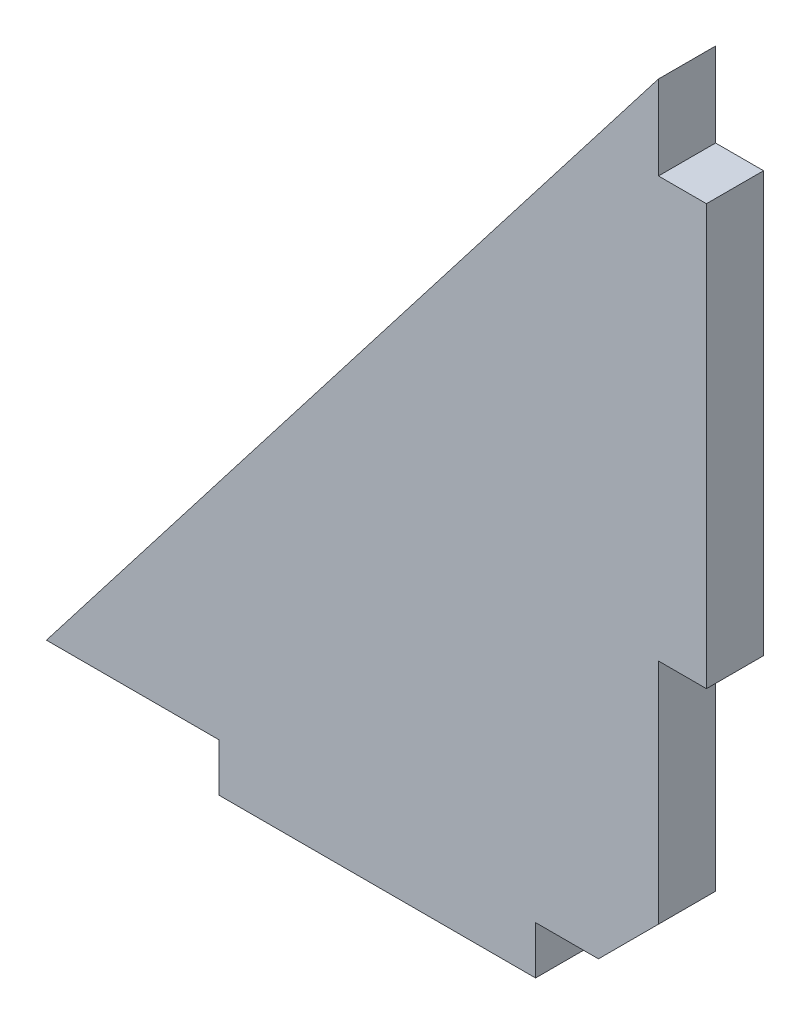
ISO-10303-21;
HEADER;
FILE_DESCRIPTION(('STEP AP214'),'2;1');
FILE_NAME('part.step','',(''),(''),'','','');
FILE_SCHEMA(('AUTOMOTIVE_DESIGN { 1 0 10303 214 1 1 1 1 }'));
ENDSEC;
DATA;
#1=APPLICATION_CONTEXT('core data for automotive mechanical design processes');
#2=APPLICATION_PROTOCOL_DEFINITION('international standard','automotive_design',2000,#1);
#3=PRODUCT_CONTEXT('',#1,'mechanical');
#4=PRODUCT('Part','Part','',(#3));
#5=PRODUCT_RELATED_PRODUCT_CATEGORY('part','',(#4));
#6=PRODUCT_DEFINITION_FORMATION('','',#4);
#7=PRODUCT_DEFINITION_CONTEXT('part definition',#1,'design');
#8=PRODUCT_DEFINITION('design','',#6,#7);
#9=PRODUCT_DEFINITION_SHAPE('','',#8);
#10=(LENGTH_UNIT() NAMED_UNIT(*) SI_UNIT(.MILLI.,.METRE.));
#11=(NAMED_UNIT(*) PLANE_ANGLE_UNIT() SI_UNIT($,.RADIAN.));
#12=(NAMED_UNIT(*) SI_UNIT($,.STERADIAN.) SOLID_ANGLE_UNIT());
#13=UNCERTAINTY_MEASURE_WITH_UNIT(LENGTH_MEASURE(1.E-05),#10,'distance_accuracy_value','');
#14=(GEOMETRIC_REPRESENTATION_CONTEXT(3) GLOBAL_UNCERTAINTY_ASSIGNED_CONTEXT((#13)) GLOBAL_UNIT_ASSIGNED_CONTEXT((#10,
#11,#12)) REPRESENTATION_CONTEXT('',''));
#15=CARTESIAN_POINT('',(0.,0.,0.));
#16=DIRECTION('',(0.,0.,1.));
#17=DIRECTION('',(1.,0.,0.));
#18=AXIS2_PLACEMENT_3D('',#15,#16,#17);
#19=CARTESIAN_POINT('',(-51.,-66.,4.76));
#20=DIRECTION('',(0.791285001392167,-0.611447501075765,0.));
#21=DIRECTION('',(0.611447501075765,0.791285001392167,0.));
#22=AXIS2_PLACEMENT_3D('',#19,#20,#21);
#23=PLANE('',#22);
#24=DIRECTION('',(-0.611447501075765,-0.791285001392167,0.));
#25=VECTOR('',#24,1.);
#26=CARTESIAN_POINT('',(-51.,-66.,0.));
#27=LINE('',#26,#25);
#28=CARTESIAN_POINT('',(0.,0.,0.));
#29=VERTEX_POINT('',#28);
#30=CARTESIAN_POINT('',(-51.,-66.,0.));
#31=VERTEX_POINT('',#30);
#32=EDGE_CURVE('E271',#29,#31,#27,.T.);
#33=ORIENTED_EDGE('',*,*,#32,.T.);
#34=DIRECTION('',(0.,0.,-1.));
#35=VECTOR('',#34,1.);
#36=CARTESIAN_POINT('',(-51.,-66.,4.76));
#37=LINE('',#36,#35);
#38=CARTESIAN_POINT('',(-51.,-66.,4.76));
#39=VERTEX_POINT('',#38);
#40=EDGE_CURVE('E12',#39,#31,#37,.T.);
#41=ORIENTED_EDGE('',*,*,#40,.F.);
#42=DIRECTION('',(-0.611447501075765,-0.791285001392167,0.));
#43=VECTOR('',#42,1.);
#44=CARTESIAN_POINT('',(-51.,-66.,4.76));
#45=LINE('',#44,#43);
#46=CARTESIAN_POINT('',(0.,0.,4.76));
#47=VERTEX_POINT('',#46);
#48=EDGE_CURVE('E209',#47,#39,#45,.T.);
#49=ORIENTED_EDGE('',*,*,#48,.F.);
#50=DIRECTION('',(0.,0.,-1.));
#51=VECTOR('',#50,1.);
#52=CARTESIAN_POINT('',(0.,0.,4.76));
#53=LINE('',#52,#51);
#54=EDGE_CURVE('E165',#47,#29,#53,.T.);
#55=ORIENTED_EDGE('',*,*,#54,.T.);
#56=EDGE_LOOP('',(#33,#41,#49,#55));
#57=FACE_BOUND('',#56,.T.);
#58=ADVANCED_FACE('F44',(#57),#23,.F.);
#59=CARTESIAN_POINT('',(-36.64,-66.,4.76));
#60=DIRECTION('',(0.,1.,0.));
#61=DIRECTION('',(0.,0.,1.));
#62=AXIS2_PLACEMENT_3D('',#59,#60,#61);
#63=PLANE('',#62);
#64=DIRECTION('',(1.,0.,0.));
#65=VECTOR('',#64,1.);
#66=CARTESIAN_POINT('',(-36.64,-66.,0.));
#67=LINE('',#66,#65);
#68=CARTESIAN_POINT('',(-36.64,-66.,0.));
#69=VERTEX_POINT('',#68);
#70=EDGE_CURVE('E262',#31,#69,#67,.T.);
#71=ORIENTED_EDGE('',*,*,#70,.T.);
#72=DIRECTION('',(0.,0.,-1.));
#73=VECTOR('',#72,1.);
#74=CARTESIAN_POINT('',(-36.64,-66.,4.76));
#75=LINE('',#74,#73);
#76=CARTESIAN_POINT('',(-36.64,-66.,4.76));
#77=VERTEX_POINT('',#76);
#78=EDGE_CURVE('E53',#77,#69,#75,.T.);
#79=ORIENTED_EDGE('',*,*,#78,.F.);
#80=DIRECTION('',(1.,0.,0.));
#81=VECTOR('',#80,1.);
#82=CARTESIAN_POINT('',(-36.64,-66.,4.76));
#83=LINE('',#82,#81);
#84=EDGE_CURVE('E116',#39,#77,#83,.T.);
#85=ORIENTED_EDGE('',*,*,#84,.F.);
#86=ORIENTED_EDGE('',*,*,#40,.T.);
#87=EDGE_LOOP('',(#71,#79,#85,#86));
#88=FACE_BOUND('',#87,.T.);
#89=ADVANCED_FACE('F307',(#88),#63,.F.);
#90=CARTESIAN_POINT('',(-36.64,-70.,4.76));
#91=DIRECTION('',(1.,0.,0.));
#92=DIRECTION('',(0.,1.,0.));
#93=AXIS2_PLACEMENT_3D('',#90,#91,#92);
#94=PLANE('',#93);
#95=DIRECTION('',(0.,-1.,0.));
#96=VECTOR('',#95,1.);
#97=CARTESIAN_POINT('',(-36.64,-70.,0.));
#98=LINE('',#97,#96);
#99=CARTESIAN_POINT('',(-36.64,-70.,0.));
#100=VERTEX_POINT('',#99);
#101=EDGE_CURVE('E257',#69,#100,#98,.T.);
#102=ORIENTED_EDGE('',*,*,#101,.T.);
#103=DIRECTION('',(0.,0.,-1.));
#104=VECTOR('',#103,1.);
#105=CARTESIAN_POINT('',(-36.64,-70.,4.76));
#106=LINE('',#105,#104);
#107=CARTESIAN_POINT('',(-36.64,-70.,4.76));
#108=VERTEX_POINT('',#107);
#109=EDGE_CURVE('E247',#108,#100,#106,.T.);
#110=ORIENTED_EDGE('',*,*,#109,.F.);
#111=DIRECTION('',(0.,-1.,0.));
#112=VECTOR('',#111,1.);
#113=CARTESIAN_POINT('',(-36.64,-70.,4.76));
#114=LINE('',#113,#112);
#115=EDGE_CURVE('E201',#77,#108,#114,.T.);
#116=ORIENTED_EDGE('',*,*,#115,.F.);
#117=ORIENTED_EDGE('',*,*,#78,.T.);
#118=EDGE_LOOP('',(#102,#110,#116,#117));
#119=FACE_BOUND('',#118,.T.);
#120=ADVANCED_FACE('F255',(#119),#94,.F.);
#121=CARTESIAN_POINT('',(-10.24,-70.,4.76));
#122=DIRECTION('',(0.,1.,0.));
#123=DIRECTION('',(0.,0.,1.));
#124=AXIS2_PLACEMENT_3D('',#121,#122,#123);
#125=PLANE('',#124);
#126=DIRECTION('',(1.,0.,0.));
#127=VECTOR('',#126,1.);
#128=CARTESIAN_POINT('',(-10.24,-70.,0.));
#129=LINE('',#128,#127);
#130=CARTESIAN_POINT('',(-10.24,-70.,0.));
#131=VERTEX_POINT('',#130);
#132=EDGE_CURVE('E264',#100,#131,#129,.T.);
#133=ORIENTED_EDGE('',*,*,#132,.T.);
#134=DIRECTION('',(0.,0.,-1.));
#135=VECTOR('',#134,1.);
#136=CARTESIAN_POINT('',(-10.24,-70.,4.76));
#137=LINE('',#136,#135);
#138=CARTESIAN_POINT('',(-10.24,-70.,4.76));
#139=VERTEX_POINT('',#138);
#140=EDGE_CURVE('E243',#139,#131,#137,.T.);
#141=ORIENTED_EDGE('',*,*,#140,.F.);
#142=DIRECTION('',(1.,0.,0.));
#143=VECTOR('',#142,1.);
#144=CARTESIAN_POINT('',(-10.24,-70.,4.76));
#145=LINE('',#144,#143);
#146=EDGE_CURVE('E197',#108,#139,#145,.T.);
#147=ORIENTED_EDGE('',*,*,#146,.F.);
#148=ORIENTED_EDGE('',*,*,#109,.T.);
#149=EDGE_LOOP('',(#133,#141,#147,#148));
#150=FACE_BOUND('',#149,.T.);
#151=ADVANCED_FACE('F314',(#150),#125,.F.);
#152=CARTESIAN_POINT('',(-10.24,-66.,4.76));
#153=DIRECTION('',(-1.,0.,0.));
#154=DIRECTION('',(0.,-1.,0.));
#155=AXIS2_PLACEMENT_3D('',#152,#153,#154);
#156=PLANE('',#155);
#157=DIRECTION('',(0.,1.,0.));
#158=VECTOR('',#157,1.);
#159=CARTESIAN_POINT('',(-10.24,-66.,0.));
#160=LINE('',#159,#158);
#161=CARTESIAN_POINT('',(-10.24,-66.,0.));
#162=VERTEX_POINT('',#161);
#163=EDGE_CURVE('E269',#131,#162,#160,.T.);
#164=ORIENTED_EDGE('',*,*,#163,.T.);
#165=DIRECTION('',(0.,0.,-1.));
#166=VECTOR('',#165,1.);
#167=CARTESIAN_POINT('',(-10.24,-66.,4.76));
#168=LINE('',#167,#166);
#169=CARTESIAN_POINT('',(-10.24,-66.,4.76));
#170=VERTEX_POINT('',#169);
#171=EDGE_CURVE('E239',#170,#162,#168,.T.);
#172=ORIENTED_EDGE('',*,*,#171,.F.);
#173=DIRECTION('',(0.,1.,0.));
#174=VECTOR('',#173,1.);
#175=CARTESIAN_POINT('',(-10.24,-66.,4.76));
#176=LINE('',#175,#174);
#177=EDGE_CURVE('E194',#139,#170,#176,.T.);
#178=ORIENTED_EDGE('',*,*,#177,.F.);
#179=ORIENTED_EDGE('',*,*,#140,.T.);
#180=EDGE_LOOP('',(#164,#172,#178,#179));
#181=FACE_BOUND('',#180,.T.);
#182=ADVANCED_FACE('F319',(#181),#156,.F.);
#183=CARTESIAN_POINT('',(-5.00000000000002,-66.,4.76));
#184=DIRECTION('',(0.,1.,0.));
#185=DIRECTION('',(0.,0.,1.));
#186=AXIS2_PLACEMENT_3D('',#183,#184,#185);
#187=PLANE('',#186);
#188=DIRECTION('',(1.,0.,0.));
#189=VECTOR('',#188,1.);
#190=CARTESIAN_POINT('',(-5.00000000000002,-66.,0.));
#191=LINE('',#190,#189);
#192=CARTESIAN_POINT('',(-5.00000000000002,-66.,0.));
#193=VERTEX_POINT('',#192);
#194=EDGE_CURVE('E276',#162,#193,#191,.T.);
#195=ORIENTED_EDGE('',*,*,#194,.T.);
#196=DIRECTION('',(0.,0.,-1.));
#197=VECTOR('',#196,1.);
#198=CARTESIAN_POINT('',(-5.00000000000002,-66.,4.76));
#199=LINE('',#198,#197);
#200=CARTESIAN_POINT('',(-5.00000000000002,-66.,4.76));
#201=VERTEX_POINT('',#200);
#202=EDGE_CURVE('E235',#201,#193,#199,.T.);
#203=ORIENTED_EDGE('',*,*,#202,.F.);
#204=DIRECTION('',(1.,0.,0.));
#205=VECTOR('',#204,1.);
#206=CARTESIAN_POINT('',(-5.00000000000002,-66.,4.76));
#207=LINE('',#206,#205);
#208=EDGE_CURVE('E186',#170,#201,#207,.T.);
#209=ORIENTED_EDGE('',*,*,#208,.F.);
#210=ORIENTED_EDGE('',*,*,#171,.T.);
#211=EDGE_LOOP('',(#195,#203,#209,#210));
#212=FACE_BOUND('',#211,.T.);
#213=ADVANCED_FACE('F323',(#212),#187,.F.);
#214=CARTESIAN_POINT('',(0.,-61.,4.76));
#215=DIRECTION('',(-0.707106781186546,0.707106781186549,0.));
#216=DIRECTION('',(-0.707106781186549,-0.707106781186546,0.));
#217=AXIS2_PLACEMENT_3D('',#214,#215,#216);
#218=PLANE('',#217);
#219=DIRECTION('',(0.707106781186549,0.707106781186546,0.));
#220=VECTOR('',#219,1.);
#221=CARTESIAN_POINT('',(0.,-61.,0.));
#222=LINE('',#221,#220);
#223=CARTESIAN_POINT('',(0.,-61.,0.));
#224=VERTEX_POINT('',#223);
#225=EDGE_CURVE('E279',#193,#224,#222,.T.);
#226=ORIENTED_EDGE('',*,*,#225,.T.);
#227=DIRECTION('',(0.,0.,-1.));
#228=VECTOR('',#227,1.);
#229=CARTESIAN_POINT('',(0.,-61.,4.76));
#230=LINE('',#229,#228);
#231=CARTESIAN_POINT('',(0.,-61.,4.76));
#232=VERTEX_POINT('',#231);
#233=EDGE_CURVE('E231',#232,#224,#230,.T.);
#234=ORIENTED_EDGE('',*,*,#233,.F.);
#235=DIRECTION('',(0.707106781186549,0.707106781186546,0.));
#236=VECTOR('',#235,1.);
#237=CARTESIAN_POINT('',(0.,-61.,4.76));
#238=LINE('',#237,#236);
#239=EDGE_CURVE('E182',#201,#232,#238,.T.);
#240=ORIENTED_EDGE('',*,*,#239,.F.);
#241=ORIENTED_EDGE('',*,*,#202,.T.);
#242=EDGE_LOOP('',(#226,#234,#240,#241));
#243=FACE_BOUND('',#242,.T.);
#244=ADVANCED_FACE('F327',(#243),#218,.F.);
#245=CARTESIAN_POINT('',(0.,-42.,4.76));
#246=DIRECTION('',(-1.,0.,0.));
#247=DIRECTION('',(0.,-1.,0.));
#248=AXIS2_PLACEMENT_3D('',#245,#246,#247);
#249=PLANE('',#248);
#250=DIRECTION('',(0.,1.,0.));
#251=VECTOR('',#250,1.);
#252=CARTESIAN_POINT('',(0.,-42.,0.));
#253=LINE('',#252,#251);
#254=CARTESIAN_POINT('',(0.,-42.,0.));
#255=VERTEX_POINT('',#254);
#256=EDGE_CURVE('E282',#224,#255,#253,.T.);
#257=ORIENTED_EDGE('',*,*,#256,.T.);
#258=DIRECTION('',(0.,0.,-1.));
#259=VECTOR('',#258,1.);
#260=CARTESIAN_POINT('',(0.,-42.,4.76));
#261=LINE('',#260,#259);
#262=CARTESIAN_POINT('',(0.,-42.,4.76));
#263=VERTEX_POINT('',#262);
#264=EDGE_CURVE('E227',#263,#255,#261,.T.);
#265=ORIENTED_EDGE('',*,*,#264,.F.);
#266=DIRECTION('',(0.,1.,0.));
#267=VECTOR('',#266,1.);
#268=CARTESIAN_POINT('',(0.,-42.,4.76));
#269=LINE('',#268,#267);
#270=EDGE_CURVE('E178',#232,#263,#269,.T.);
#271=ORIENTED_EDGE('',*,*,#270,.F.);
#272=ORIENTED_EDGE('',*,*,#233,.T.);
#273=EDGE_LOOP('',(#257,#265,#271,#272));
#274=FACE_BOUND('',#273,.T.);
#275=ADVANCED_FACE('F331',(#274),#249,.F.);
#276=CARTESIAN_POINT('',(4.00000000000001,-42.,4.76));
#277=DIRECTION('',(0.,1.,0.));
#278=DIRECTION('',(0.,0.,1.));
#279=AXIS2_PLACEMENT_3D('',#276,#277,#278);
#280=PLANE('',#279);
#281=DIRECTION('',(1.,0.,0.));
#282=VECTOR('',#281,1.);
#283=CARTESIAN_POINT('',(4.00000000000001,-42.,0.));
#284=LINE('',#283,#282);
#285=CARTESIAN_POINT('',(4.00000000000001,-42.,0.));
#286=VERTEX_POINT('',#285);
#287=EDGE_CURVE('E285',#255,#286,#284,.T.);
#288=ORIENTED_EDGE('',*,*,#287,.T.);
#289=DIRECTION('',(0.,0.,-1.));
#290=VECTOR('',#289,1.);
#291=CARTESIAN_POINT('',(4.00000000000001,-42.,4.76));
#292=LINE('',#291,#290);
#293=CARTESIAN_POINT('',(4.00000000000001,-42.,4.76));
#294=VERTEX_POINT('',#293);
#295=EDGE_CURVE('E158',#294,#286,#292,.T.);
#296=ORIENTED_EDGE('',*,*,#295,.F.);
#297=DIRECTION('',(1.,0.,0.));
#298=VECTOR('',#297,1.);
#299=CARTESIAN_POINT('',(4.00000000000001,-42.,4.76));
#300=LINE('',#299,#298);
#301=EDGE_CURVE('E147',#263,#294,#300,.T.);
#302=ORIENTED_EDGE('',*,*,#301,.F.);
#303=ORIENTED_EDGE('',*,*,#264,.T.);
#304=EDGE_LOOP('',(#288,#296,#302,#303));
#305=FACE_BOUND('',#304,.T.);
#306=ADVANCED_FACE('F290',(#305),#280,.F.);
#307=CARTESIAN_POINT('',(4.,-7.,4.76));
#308=DIRECTION('',(-1.,0.,0.));
#309=DIRECTION('',(0.,-1.,0.));
#310=AXIS2_PLACEMENT_3D('',#307,#308,#309);
#311=PLANE('',#310);
#312=DIRECTION('',(0.,1.,0.));
#313=VECTOR('',#312,1.);
#314=CARTESIAN_POINT('',(4.,-7.,0.));
#315=LINE('',#314,#313);
#316=CARTESIAN_POINT('',(4.,-7.,0.));
#317=VERTEX_POINT('',#316);
#318=EDGE_CURVE('E156',#286,#317,#315,.T.);
#319=ORIENTED_EDGE('',*,*,#318,.T.);
#320=DIRECTION('',(0.,0.,-1.));
#321=VECTOR('',#320,1.);
#322=CARTESIAN_POINT('',(4.,-7.,4.76));
#323=LINE('',#322,#321);
#324=CARTESIAN_POINT('',(4.,-7.,4.76));
#325=VERTEX_POINT('',#324);
#326=EDGE_CURVE('E153',#325,#317,#323,.T.);
#327=ORIENTED_EDGE('',*,*,#326,.F.);
#328=DIRECTION('',(0.,1.,0.));
#329=VECTOR('',#328,1.);
#330=CARTESIAN_POINT('',(4.,-7.,4.76));
#331=LINE('',#330,#329);
#332=EDGE_CURVE('E141',#294,#325,#331,.T.);
#333=ORIENTED_EDGE('',*,*,#332,.F.);
#334=ORIENTED_EDGE('',*,*,#295,.T.);
#335=EDGE_LOOP('',(#319,#327,#333,#334));
#336=FACE_BOUND('',#335,.T.);
#337=ADVANCED_FACE('F154',(#336),#311,.F.);
#338=CARTESIAN_POINT('',(0.,-7.,4.76));
#339=DIRECTION('',(0.,-1.,0.));
#340=DIRECTION('',(0.,0.,-1.));
#341=AXIS2_PLACEMENT_3D('',#338,#339,#340);
#342=PLANE('',#341);
#343=DIRECTION('',(-1.,0.,0.));
#344=VECTOR('',#343,1.);
#345=CARTESIAN_POINT('',(0.,-7.,0.));
#346=LINE('',#345,#344);
#347=CARTESIAN_POINT('',(0.,-7.,0.));
#348=VERTEX_POINT('',#347);
#349=EDGE_CURVE('E102',#317,#348,#346,.T.);
#350=ORIENTED_EDGE('',*,*,#349,.T.);
#351=DIRECTION('',(0.,0.,-1.));
#352=VECTOR('',#351,1.);
#353=CARTESIAN_POINT('',(0.,-7.,4.76));
#354=LINE('',#353,#352);
#355=CARTESIAN_POINT('',(0.,-7.,4.76));
#356=VERTEX_POINT('',#355);
#357=EDGE_CURVE('E159',#356,#348,#354,.T.);
#358=ORIENTED_EDGE('',*,*,#357,.F.);
#359=DIRECTION('',(-1.,0.,0.));
#360=VECTOR('',#359,1.);
#361=CARTESIAN_POINT('',(0.,-7.,4.76));
#362=LINE('',#361,#360);
#363=EDGE_CURVE('E145',#325,#356,#362,.T.);
#364=ORIENTED_EDGE('',*,*,#363,.F.);
#365=ORIENTED_EDGE('',*,*,#326,.T.);
#366=EDGE_LOOP('',(#350,#358,#364,#365));
#367=FACE_BOUND('',#366,.T.);
#368=ADVANCED_FACE('F161',(#367),#342,.F.);
#369=CARTESIAN_POINT('',(0.,0.,4.76));
#370=DIRECTION('',(-1.,0.,0.));
#371=DIRECTION('',(0.,-1.,0.));
#372=AXIS2_PLACEMENT_3D('',#369,#370,#371);
#373=PLANE('',#372);
#374=DIRECTION('',(0.,1.,0.));
#375=VECTOR('',#374,1.);
#376=CARTESIAN_POINT('',(0.,0.,0.));
#377=LINE('',#376,#375);
#378=EDGE_CURVE('E108',#348,#29,#377,.T.);
#379=ORIENTED_EDGE('',*,*,#378,.T.);
#380=ORIENTED_EDGE('',*,*,#54,.F.);
#381=DIRECTION('',(0.,1.,0.));
#382=VECTOR('',#381,1.);
#383=CARTESIAN_POINT('',(0.,0.,4.76));
#384=LINE('',#383,#382);
#385=EDGE_CURVE('E61',#356,#47,#384,.T.);
#386=ORIENTED_EDGE('',*,*,#385,.F.);
#387=ORIENTED_EDGE('',*,*,#357,.T.);
#388=EDGE_LOOP('',(#379,#380,#386,#387));
#389=FACE_BOUND('',#388,.T.);
#390=ADVANCED_FACE('F296',(#389),#373,.F.);
#391=CARTESIAN_POINT('',(0.,0.,4.76));
#392=DIRECTION('',(0.,0.,-1.));
#393=DIRECTION('',(-1.,0.,0.));
#394=AXIS2_PLACEMENT_3D('',#391,#392,#393);
#395=PLANE('',#394);
#396=ORIENTED_EDGE('',*,*,#48,.T.);
#397=ORIENTED_EDGE('',*,*,#84,.T.);
#398=ORIENTED_EDGE('',*,*,#115,.T.);
#399=ORIENTED_EDGE('',*,*,#146,.T.);
#400=ORIENTED_EDGE('',*,*,#177,.T.);
#401=ORIENTED_EDGE('',*,*,#208,.T.);
#402=ORIENTED_EDGE('',*,*,#239,.T.);
#403=ORIENTED_EDGE('',*,*,#270,.T.);
#404=ORIENTED_EDGE('',*,*,#301,.T.);
#405=ORIENTED_EDGE('',*,*,#332,.T.);
#406=ORIENTED_EDGE('',*,*,#363,.T.);
#407=ORIENTED_EDGE('',*,*,#385,.T.);
#408=EDGE_LOOP('',(#396,#397,#398,#399,#400,#401,#402,#403,#404,#405,#406,#407));
#409=FACE_BOUND('',#408,.T.);
#410=ADVANCED_FACE('F143',(#409),#395,.F.);
#411=CARTESIAN_POINT('',(0.,0.,0.));
#412=DIRECTION('',(0.,0.,-1.));
#413=DIRECTION('',(-1.,0.,0.));
#414=AXIS2_PLACEMENT_3D('',#411,#412,#413);
#415=PLANE('',#414);
#416=ORIENTED_EDGE('',*,*,#32,.F.);
#417=ORIENTED_EDGE('',*,*,#378,.F.);
#418=ORIENTED_EDGE('',*,*,#349,.F.);
#419=ORIENTED_EDGE('',*,*,#318,.F.);
#420=ORIENTED_EDGE('',*,*,#287,.F.);
#421=ORIENTED_EDGE('',*,*,#256,.F.);
#422=ORIENTED_EDGE('',*,*,#225,.F.);
#423=ORIENTED_EDGE('',*,*,#194,.F.);
#424=ORIENTED_EDGE('',*,*,#163,.F.);
#425=ORIENTED_EDGE('',*,*,#132,.F.);
#426=ORIENTED_EDGE('',*,*,#101,.F.);
#427=ORIENTED_EDGE('',*,*,#70,.F.);
#428=EDGE_LOOP('',(#416,#417,#418,#419,#420,#421,#422,#423,#424,#425,#426,#427));
#429=FACE_BOUND('',#428,.T.);
#430=ADVANCED_FACE('F261',(#429),#415,.T.);
#431=CLOSED_SHELL('',(#58,#89,#120,#151,#182,#213,#244,#275,#306,#337,#368,#390,#410,#430));
#432=MANIFOLD_SOLID_BREP('B2',#431);
#433=ADVANCED_BREP_SHAPE_REPRESENTATION('',(#18,#432),#14);
#434=SHAPE_DEFINITION_REPRESENTATION(#9,#433);
ENDSEC;
END-ISO-10303-21;
